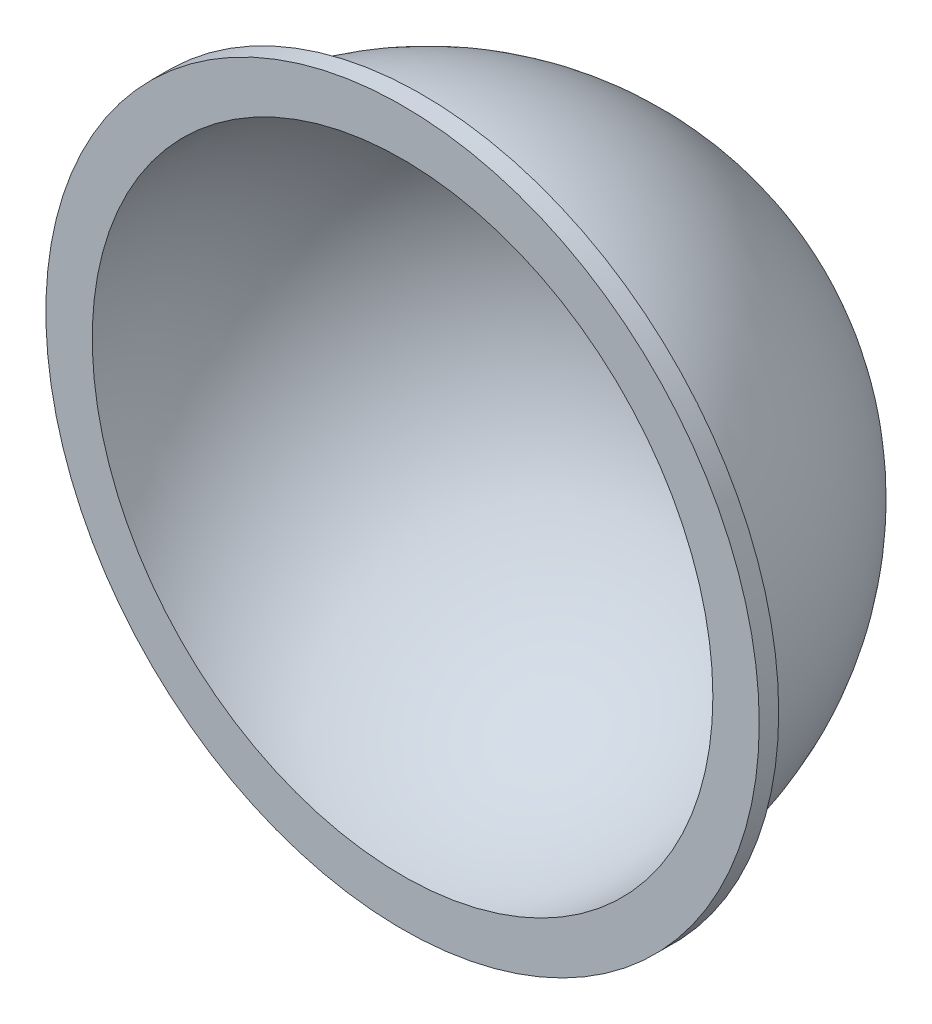
ISO-10303-21;
HEADER;
FILE_DESCRIPTION(('STEP AP214'),'2;1');
FILE_NAME('part.step','',(''),(''),'','','');
FILE_SCHEMA(('AUTOMOTIVE_DESIGN { 1 0 10303 214 1 1 1 1 }'));
ENDSEC;
DATA;
#1=APPLICATION_CONTEXT('core data for automotive mechanical design processes');
#2=APPLICATION_PROTOCOL_DEFINITION('international standard','automotive_design',2000,#1);
#3=PRODUCT_CONTEXT('',#1,'mechanical');
#4=PRODUCT('Part','Part','',(#3));
#5=PRODUCT_RELATED_PRODUCT_CATEGORY('part','',(#4));
#6=PRODUCT_DEFINITION_FORMATION('','',#4);
#7=PRODUCT_DEFINITION_CONTEXT('part definition',#1,'design');
#8=PRODUCT_DEFINITION('design','',#6,#7);
#9=PRODUCT_DEFINITION_SHAPE('','',#8);
#10=(LENGTH_UNIT() NAMED_UNIT(*) SI_UNIT(.MILLI.,.METRE.));
#11=(NAMED_UNIT(*) PLANE_ANGLE_UNIT() SI_UNIT($,.RADIAN.));
#12=(NAMED_UNIT(*) SI_UNIT($,.STERADIAN.) SOLID_ANGLE_UNIT());
#13=UNCERTAINTY_MEASURE_WITH_UNIT(LENGTH_MEASURE(1.E-05),#10,'distance_accuracy_value','');
#14=(GEOMETRIC_REPRESENTATION_CONTEXT(3) GLOBAL_UNCERTAINTY_ASSIGNED_CONTEXT((#13)) GLOBAL_UNIT_ASSIGNED_CONTEXT((#10,
#11,#12)) REPRESENTATION_CONTEXT('',''));
#15=CARTESIAN_POINT('',(0.,0.,0.));
#16=DIRECTION('',(0.,0.,1.));
#17=DIRECTION('',(1.,0.,0.));
#18=AXIS2_PLACEMENT_3D('',#15,#16,#17);
#19=CARTESIAN_POINT('',(0.,0.,0.));
#20=DIRECTION('',(0.,0.,1.));
#21=DIRECTION('',(1.,0.,0.));
#22=AXIS2_PLACEMENT_3D('',#19,#20,#21);
#23=CYLINDRICAL_SURFACE('',#22,55.);
#24=CARTESIAN_POINT('',(0.,0.,0.));
#25=DIRECTION('',(0.,0.,1.));
#26=DIRECTION('',(1.,0.,0.));
#27=AXIS2_PLACEMENT_3D('',#24,#25,#26);
#28=CIRCLE('',#27,55.);
#29=CARTESIAN_POINT('',(55.,0.,0.));
#30=VERTEX_POINT('',#29);
#31=EDGE_CURVE('E61',#30,#30,#28,.T.);
#32=ORIENTED_EDGE('',*,*,#31,.F.);
#33=EDGE_LOOP('',(#32));
#34=FACE_BOUND('',#33,.T.);
#35=CARTESIAN_POINT('',(0.,0.,-3.));
#36=DIRECTION('',(0.,0.,1.));
#37=DIRECTION('',(1.,0.,0.));
#38=AXIS2_PLACEMENT_3D('',#35,#36,#37);
#39=CIRCLE('',#38,55.);
#40=CARTESIAN_POINT('',(55.,0.,-3.));
#41=VERTEX_POINT('',#40);
#42=EDGE_CURVE('E11',#41,#41,#39,.T.);
#43=ORIENTED_EDGE('',*,*,#42,.T.);
#44=EDGE_LOOP('',(#43));
#45=FACE_BOUND('',#44,.T.);
#46=ADVANCED_FACE('F38',(#34,#45),#23,.T.);
#47=CARTESIAN_POINT('',(-55.,0.,-2.99999999999999));
#48=DIRECTION('',(0.,0.,1.));
#49=DIRECTION('',(1.,0.,0.));
#50=AXIS2_PLACEMENT_3D('',#47,#48,#49);
#51=PLANE('',#50);
#52=ORIENTED_EDGE('',*,*,#42,.F.);
#53=EDGE_LOOP('',(#52));
#54=FACE_BOUND('',#53,.T.);
#55=CARTESIAN_POINT('',(0.,0.,-2.99999999999999));
#56=DIRECTION('',(0.,0.,1.));
#57=DIRECTION('',(1.,0.,0.));
#58=AXIS2_PLACEMENT_3D('',#55,#56,#57);
#59=CIRCLE('',#58,50.);
#60=CARTESIAN_POINT('',(50.,0.,-2.99999999999999));
#61=VERTEX_POINT('',#60);
#62=EDGE_CURVE('E45',#61,#61,#59,.T.);
#63=ORIENTED_EDGE('',*,*,#62,.T.);
#64=EDGE_LOOP('',(#63));
#65=FACE_BOUND('',#64,.T.);
#66=ADVANCED_FACE('F71',(#54,#65),#51,.F.);
#67=CARTESIAN_POINT('',(-2.04,0.,-3.));
#68=DIRECTION('',(0.,-1.,0.));
#69=DIRECTION('',(1.,0.,0.));
#70=AXIS2_PLACEMENT_3D('',#67,#68,#69);
#71=CIRCLE('',#70,52.04);
#72=TRIMMED_CURVE('',#71,(PARAMETER_VALUE(-1.53158566508049)),
(PARAMETER_VALUE(1.53158566508049)),.T.,.PARAMETER.);
#73=CARTESIAN_POINT('',(0.,0.,-3.));
#74=DIRECTION('',(0.,0.,1.));
#75=AXIS1_PLACEMENT('',#73,#74);
#76=SURFACE_OF_REVOLUTION('',#72,#75);
#77=ORIENTED_EDGE('',*,*,#62,.F.);
#78=EDGE_LOOP('',(#77));
#79=FACE_BOUND('',#78,.T.);
#80=CARTESIAN_POINT('',(0.,0.,-55.));
#81=VERTEX_POINT('',#80);
#82=VERTEX_LOOP('',#81);
#83=FACE_BOUND('',#82,.T.);
#84=ADVANCED_FACE('F55',(#79,#83),#76,.T.);
#85=CARTESIAN_POINT('',(3.03682325106173,0.,0.));
#86=DIRECTION('',(0.,-1.,0.));
#87=DIRECTION('',(1.,0.,0.));
#88=AXIS2_PLACEMENT_3D('',#85,#86,#87);
#89=CIRCLE('',#88,44.8113043125576);
#90=TRIMMED_CURVE('',#89,(PARAMETER_VALUE(-1.63861744088009)),
(PARAMETER_VALUE(1.63861744088009)),.T.,.PARAMETER.);
#91=CARTESIAN_POINT('',(0.,0.,0.));
#92=DIRECTION('',(0.,0.,1.));
#93=AXIS1_PLACEMENT('',#91,#92);
#94=SURFACE_OF_REVOLUTION('',#90,#93);
#95=CARTESIAN_POINT('',(0.,0.,-44.7082844530458));
#96=VERTEX_POINT('',#95);
#97=VERTEX_LOOP('',#96);
#98=FACE_BOUND('',#97,.T.);
#99=CARTESIAN_POINT('',(0.,0.,0.));
#100=DIRECTION('',(0.,0.,1.));
#101=DIRECTION('',(1.,0.,0.));
#102=AXIS2_PLACEMENT_3D('',#99,#100,#101);
#103=CIRCLE('',#102,47.8481275636194);
#104=CARTESIAN_POINT('',(47.8481275636194,0.,0.));
#105=VERTEX_POINT('',#104);
#106=EDGE_CURVE('E59',#105,#105,#103,.T.);
#107=ORIENTED_EDGE('',*,*,#106,.T.);
#108=EDGE_LOOP('',(#107));
#109=FACE_BOUND('',#108,.T.);
#110=ADVANCED_FACE('F51',(#98,#109),#94,.F.);
#111=CARTESIAN_POINT('',(-55.,0.,0.));
#112=DIRECTION('',(0.,0.,-1.));
#113=DIRECTION('',(-1.,0.,0.));
#114=AXIS2_PLACEMENT_3D('',#111,#112,#113);
#115=PLANE('',#114);
#116=ORIENTED_EDGE('',*,*,#106,.F.);
#117=EDGE_LOOP('',(#116));
#118=FACE_BOUND('',#117,.T.);
#119=ORIENTED_EDGE('',*,*,#31,.T.);
#120=EDGE_LOOP('',(#119));
#121=FACE_BOUND('',#120,.T.);
#122=ADVANCED_FACE('F54',(#118,#121),#115,.F.);
#123=CLOSED_SHELL('',(#46,#66,#84,#110,#122));
#124=MANIFOLD_SOLID_BREP('B2',#123);
#125=ADVANCED_BREP_SHAPE_REPRESENTATION('',(#18,#124),#14);
#126=SHAPE_DEFINITION_REPRESENTATION(#9,#125);
ENDSEC;
END-ISO-10303-21;
